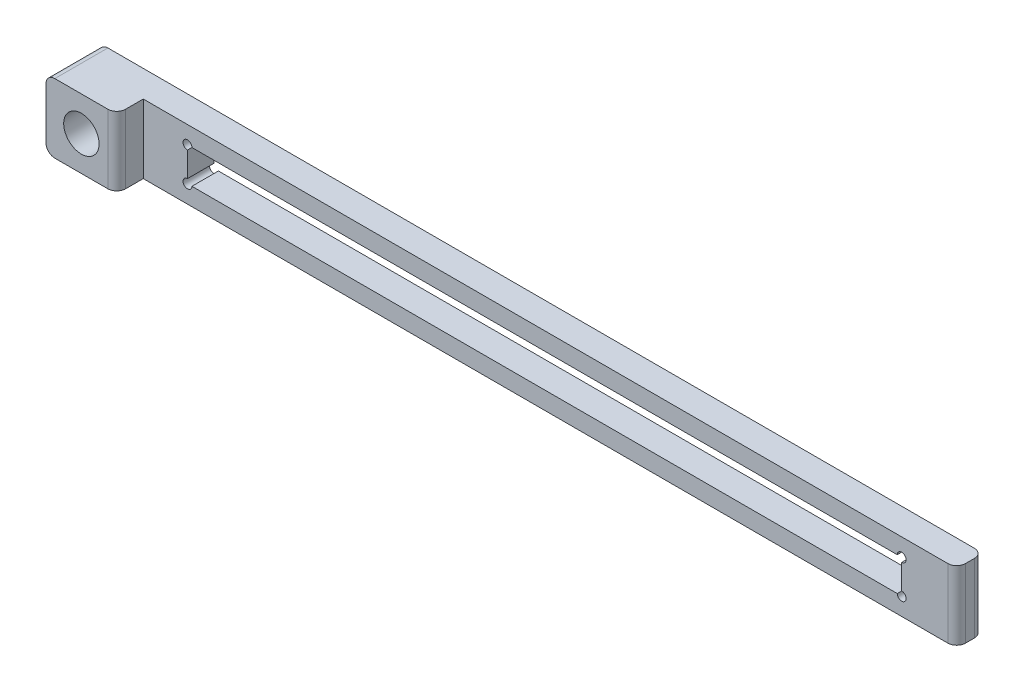
ISO-10303-21;
HEADER;
FILE_DESCRIPTION(('STEP AP214'),'2;1');
FILE_NAME('part.step','',(''),(''),'','','');
FILE_SCHEMA(('AUTOMOTIVE_DESIGN { 1 0 10303 214 1 1 1 1 }'));
ENDSEC;
DATA;
#1=APPLICATION_CONTEXT('core data for automotive mechanical design processes');
#2=APPLICATION_PROTOCOL_DEFINITION('international standard','automotive_design',2000,#1);
#3=PRODUCT_CONTEXT('',#1,'mechanical');
#4=PRODUCT('Part','Part','',(#3));
#5=PRODUCT_RELATED_PRODUCT_CATEGORY('part','',(#4));
#6=PRODUCT_DEFINITION_FORMATION('','',#4);
#7=PRODUCT_DEFINITION_CONTEXT('part definition',#1,'design');
#8=PRODUCT_DEFINITION('design','',#6,#7);
#9=PRODUCT_DEFINITION_SHAPE('','',#8);
#10=(LENGTH_UNIT() NAMED_UNIT(*) SI_UNIT(.MILLI.,.METRE.));
#11=(NAMED_UNIT(*) PLANE_ANGLE_UNIT() SI_UNIT($,.RADIAN.));
#12=(NAMED_UNIT(*) SI_UNIT($,.STERADIAN.) SOLID_ANGLE_UNIT());
#13=UNCERTAINTY_MEASURE_WITH_UNIT(LENGTH_MEASURE(1.E-05),#10,'distance_accuracy_value','');
#14=(GEOMETRIC_REPRESENTATION_CONTEXT(3) GLOBAL_UNCERTAINTY_ASSIGNED_CONTEXT((#13)) GLOBAL_UNIT_ASSIGNED_CONTEXT((#10,
#11,#12)) REPRESENTATION_CONTEXT('',''));
#15=CARTESIAN_POINT('',(0.,0.,0.));
#16=DIRECTION('',(0.,0.,1.));
#17=DIRECTION('',(1.,0.,0.));
#18=AXIS2_PLACEMENT_3D('',#15,#16,#17);
#19=CARTESIAN_POINT('',(0.,0.,1.5));
#20=DIRECTION('',(0.,0.,1.));
#21=DIRECTION('',(1.,0.,0.));
#22=AXIS2_PLACEMENT_3D('',#19,#20,#21);
#23=PLANE('',#22);
#24=CARTESIAN_POINT('',(-37.,-1.9,1.5));
#25=DIRECTION('',(0.,0.,1.));
#26=DIRECTION('',(1.,0.,0.));
#27=AXIS2_PLACEMENT_3D('',#24,#25,#26);
#28=CIRCLE('',#27,0.499999999999999);
#29=CARTESIAN_POINT('',(-37.,-1.4,1.5));
#30=VERTEX_POINT('',#29);
#31=CARTESIAN_POINT('',(-36.5,-1.9,1.5));
#32=VERTEX_POINT('',#31);
#33=EDGE_CURVE('E47',#30,#32,#28,.T.);
#34=ORIENTED_EDGE('',*,*,#33,.F.);
#35=DIRECTION('',(0.,-1.,0.));
#36=VECTOR('',#35,1.);
#37=CARTESIAN_POINT('',(-37.,1.9,1.5));
#38=LINE('',#37,#36);
#39=CARTESIAN_POINT('',(-37.,1.4,1.5));
#40=VERTEX_POINT('',#39);
#41=EDGE_CURVE('E190',#40,#30,#38,.T.);
#42=ORIENTED_EDGE('',*,*,#41,.F.);
#43=CARTESIAN_POINT('',(-37.,1.9,1.5));
#44=DIRECTION('',(0.,0.,1.));
#45=DIRECTION('',(1.,0.,0.));
#46=AXIS2_PLACEMENT_3D('',#43,#44,#45);
#47=CIRCLE('',#46,0.499999999999999);
#48=CARTESIAN_POINT('',(-36.5,1.9,1.5));
#49=VERTEX_POINT('',#48);
#50=EDGE_CURVE('E247',#49,#40,#47,.T.);
#51=ORIENTED_EDGE('',*,*,#50,.F.);
#52=DIRECTION('',(-1.,0.,0.));
#53=VECTOR('',#52,1.);
#54=CARTESIAN_POINT('',(-37.,1.9,1.5));
#55=LINE('',#54,#53);
#56=CARTESIAN_POINT('',(43.28,1.9,1.5));
#57=VERTEX_POINT('',#56);
#58=EDGE_CURVE('E182',#57,#49,#55,.T.);
#59=ORIENTED_EDGE('',*,*,#58,.F.);
#60=CARTESIAN_POINT('',(43.78,1.9,1.5));
#61=DIRECTION('',(0.,0.,1.));
#62=DIRECTION('',(1.,0.,0.));
#63=AXIS2_PLACEMENT_3D('',#60,#61,#62);
#64=CIRCLE('',#63,0.499999999999999);
#65=CARTESIAN_POINT('',(43.78,1.4,1.5));
#66=VERTEX_POINT('',#65);
#67=EDGE_CURVE('E165',#66,#57,#64,.T.);
#68=ORIENTED_EDGE('',*,*,#67,.F.);
#69=DIRECTION('',(0.,1.,0.));
#70=VECTOR('',#69,1.);
#71=CARTESIAN_POINT('',(43.78,1.9,1.5));
#72=LINE('',#71,#70);
#73=CARTESIAN_POINT('',(43.78,-1.4,1.5));
#74=VERTEX_POINT('',#73);
#75=EDGE_CURVE('E180',#74,#66,#72,.T.);
#76=ORIENTED_EDGE('',*,*,#75,.F.);
#77=CARTESIAN_POINT('',(43.78,-1.9,1.5));
#78=DIRECTION('',(0.,0.,1.));
#79=DIRECTION('',(1.,0.,0.));
#80=AXIS2_PLACEMENT_3D('',#77,#78,#79);
#81=CIRCLE('',#80,0.499999999999999);
#82=CARTESIAN_POINT('',(43.28,-1.9,1.5));
#83=VERTEX_POINT('',#82);
#84=EDGE_CURVE('E55',#83,#74,#81,.T.);
#85=ORIENTED_EDGE('',*,*,#84,.F.);
#86=DIRECTION('',(1.,0.,0.));
#87=VECTOR('',#86,1.);
#88=CARTESIAN_POINT('',(-37.,-1.9,1.5));
#89=LINE('',#88,#87);
#90=EDGE_CURVE('E185',#32,#83,#89,.T.);
#91=ORIENTED_EDGE('',*,*,#90,.F.);
#92=EDGE_LOOP('',(#34,#42,#51,#59,#68,#76,#85,#91));
#93=FACE_BOUND('',#92,.T.);
#94=DIRECTION('',(1.,0.,0.));
#95=VECTOR('',#94,1.);
#96=CARTESIAN_POINT('',(-50.,-3.9,1.5));
#97=LINE('',#96,#95);
#98=CARTESIAN_POINT('',(-42.,-3.9,1.5));
#99=VERTEX_POINT('',#98);
#100=CARTESIAN_POINT('',(49.,-3.9,1.5));
#101=VERTEX_POINT('',#100);
#102=EDGE_CURVE('E213',#99,#101,#97,.T.);
#103=ORIENTED_EDGE('',*,*,#102,.T.);
#104=DIRECTION('',(0.,1.,0.));
#105=VECTOR('',#104,1.);
#106=CARTESIAN_POINT('',(49.,3.9,1.5));
#107=LINE('',#106,#105);
#108=CARTESIAN_POINT('',(49.,3.9,1.5));
#109=VERTEX_POINT('',#108);
#110=EDGE_CURVE('E217',#101,#109,#107,.T.);
#111=ORIENTED_EDGE('',*,*,#110,.T.);
#112=DIRECTION('',(-1.,0.,0.));
#113=VECTOR('',#112,1.);
#114=CARTESIAN_POINT('',(-50.,3.9,1.5));
#115=LINE('',#114,#113);
#116=CARTESIAN_POINT('',(-42.,3.9,1.5));
#117=VERTEX_POINT('',#116);
#118=EDGE_CURVE('E210',#109,#117,#115,.T.);
#119=ORIENTED_EDGE('',*,*,#118,.T.);
#120=DIRECTION('',(0.,1.,0.));
#121=VECTOR('',#120,1.);
#122=CARTESIAN_POINT('',(-42.,3.9,1.5));
#123=LINE('',#122,#121);
#124=EDGE_CURVE('E262',#99,#117,#123,.T.);
#125=ORIENTED_EDGE('',*,*,#124,.F.);
#126=EDGE_LOOP('',(#103,#111,#119,#125));
#127=FACE_BOUND('',#126,.T.);
#128=ADVANCED_FACE('F33',(#93,#127),#23,.T.);
#129=CARTESIAN_POINT('',(0.,0.,-1.5));
#130=DIRECTION('',(0.,0.,1.));
#131=DIRECTION('',(1.,0.,0.));
#132=AXIS2_PLACEMENT_3D('',#129,#130,#131);
#133=PLANE('',#132);
#134=CARTESIAN_POINT('',(-46.,0.,-1.5));
#135=DIRECTION('',(0.,0.,1.));
#136=DIRECTION('',(1.,0.,0.));
#137=AXIS2_PLACEMENT_3D('',#134,#135,#136);
#138=CIRCLE('',#137,2.);
#139=CARTESIAN_POINT('',(-44.,0.,-1.5));
#140=VERTEX_POINT('',#139);
#141=EDGE_CURVE('E254',#140,#140,#138,.T.);
#142=ORIENTED_EDGE('',*,*,#141,.T.);
#143=EDGE_LOOP('',(#142));
#144=FACE_BOUND('',#143,.T.);
#145=DIRECTION('',(-1.,0.,0.));
#146=VECTOR('',#145,1.);
#147=CARTESIAN_POINT('',(-50.,3.9,-1.5));
#148=LINE('',#147,#146);
#149=CARTESIAN_POINT('',(49.,3.9,-1.5));
#150=VERTEX_POINT('',#149);
#151=CARTESIAN_POINT('',(-49.,3.9,-1.5));
#152=VERTEX_POINT('',#151);
#153=EDGE_CURVE('E187',#150,#152,#148,.T.);
#154=ORIENTED_EDGE('',*,*,#153,.F.);
#155=DIRECTION('',(0.,1.,0.));
#156=VECTOR('',#155,1.);
#157=CARTESIAN_POINT('',(49.,0.,-1.5));
#158=LINE('',#157,#156);
#159=CARTESIAN_POINT('',(49.,-3.9,-1.5));
#160=VERTEX_POINT('',#159);
#161=EDGE_CURVE('E295',#150,#160,#158,.F.);
#162=ORIENTED_EDGE('',*,*,#161,.T.);
#163=DIRECTION('',(1.,0.,0.));
#164=VECTOR('',#163,1.);
#165=CARTESIAN_POINT('',(-50.,-3.9,-1.5));
#166=LINE('',#165,#164);
#167=CARTESIAN_POINT('',(-49.,-3.9,-1.5));
#168=VERTEX_POINT('',#167);
#169=EDGE_CURVE('E214',#168,#160,#166,.T.);
#170=ORIENTED_EDGE('',*,*,#169,.F.);
#171=CARTESIAN_POINT('',(-49.,-2.9,-1.5));
#172=DIRECTION('',(0.,0.,1.));
#173=DIRECTION('',(1.,0.,0.));
#174=AXIS2_PLACEMENT_3D('',#171,#172,#173);
#175=CIRCLE('',#174,1.);
#176=CARTESIAN_POINT('',(-50.,-2.89999999999999,-1.5));
#177=VERTEX_POINT('',#176);
#178=EDGE_CURVE('E348',#168,#177,#175,.F.);
#179=ORIENTED_EDGE('',*,*,#178,.T.);
#180=DIRECTION('',(0.,-1.,0.));
#181=VECTOR('',#180,1.);
#182=CARTESIAN_POINT('',(-50.,3.9,-1.5));
#183=LINE('',#182,#181);
#184=CARTESIAN_POINT('',(-50.,2.9,-1.5));
#185=VERTEX_POINT('',#184);
#186=EDGE_CURVE('E323',#185,#177,#183,.T.);
#187=ORIENTED_EDGE('',*,*,#186,.F.);
#188=CARTESIAN_POINT('',(-49.,2.9,-1.5));
#189=DIRECTION('',(0.,0.,1.));
#190=DIRECTION('',(1.,0.,0.));
#191=AXIS2_PLACEMENT_3D('',#188,#189,#190);
#192=CIRCLE('',#191,1.);
#193=EDGE_CURVE('E335',#185,#152,#192,.F.);
#194=ORIENTED_EDGE('',*,*,#193,.T.);
#195=EDGE_LOOP('',(#154,#162,#170,#179,#187,#194));
#196=FACE_BOUND('',#195,.T.);
#197=DIRECTION('',(0.,-1.,0.));
#198=VECTOR('',#197,1.);
#199=CARTESIAN_POINT('',(-37.,1.9,-1.5));
#200=LINE('',#199,#198);
#201=CARTESIAN_POINT('',(-37.,1.4,-1.5));
#202=VERTEX_POINT('',#201);
#203=CARTESIAN_POINT('',(-37.,-1.4,-1.5));
#204=VERTEX_POINT('',#203);
#205=EDGE_CURVE('E194',#202,#204,#200,.T.);
#206=ORIENTED_EDGE('',*,*,#205,.T.);
#207=CARTESIAN_POINT('',(-37.,-1.9,-1.5));
#208=DIRECTION('',(0.,0.,1.));
#209=DIRECTION('',(1.,0.,0.));
#210=AXIS2_PLACEMENT_3D('',#207,#208,#209);
#211=CIRCLE('',#210,0.499999999999999);
#212=CARTESIAN_POINT('',(-36.5,-1.9,-1.5));
#213=VERTEX_POINT('',#212);
#214=EDGE_CURVE('E174',#204,#213,#211,.T.);
#215=ORIENTED_EDGE('',*,*,#214,.T.);
#216=DIRECTION('',(1.,0.,0.));
#217=VECTOR('',#216,1.);
#218=CARTESIAN_POINT('',(-37.,-1.9,-1.5));
#219=LINE('',#218,#217);
#220=CARTESIAN_POINT('',(43.28,-1.9,-1.5));
#221=VERTEX_POINT('',#220);
#222=EDGE_CURVE('E197',#213,#221,#219,.T.);
#223=ORIENTED_EDGE('',*,*,#222,.T.);
#224=CARTESIAN_POINT('',(43.78,-1.9,-1.5));
#225=DIRECTION('',(0.,0.,1.));
#226=DIRECTION('',(1.,0.,0.));
#227=AXIS2_PLACEMENT_3D('',#224,#225,#226);
#228=CIRCLE('',#227,0.499999999999999);
#229=CARTESIAN_POINT('',(43.78,-1.4,-1.5));
#230=VERTEX_POINT('',#229);
#231=EDGE_CURVE('E232',#221,#230,#228,.T.);
#232=ORIENTED_EDGE('',*,*,#231,.T.);
#233=DIRECTION('',(0.,1.,0.));
#234=VECTOR('',#233,1.);
#235=CARTESIAN_POINT('',(43.78,1.9,-1.5));
#236=LINE('',#235,#234);
#237=CARTESIAN_POINT('',(43.78,1.4,-1.5));
#238=VERTEX_POINT('',#237);
#239=EDGE_CURVE('E201',#230,#238,#236,.T.);
#240=ORIENTED_EDGE('',*,*,#239,.T.);
#241=CARTESIAN_POINT('',(43.78,1.9,-1.5));
#242=DIRECTION('',(0.,0.,1.));
#243=DIRECTION('',(1.,0.,0.));
#244=AXIS2_PLACEMENT_3D('',#241,#242,#243);
#245=CIRCLE('',#244,0.499999999999999);
#246=CARTESIAN_POINT('',(43.28,1.9,-1.5));
#247=VERTEX_POINT('',#246);
#248=EDGE_CURVE('E168',#238,#247,#245,.T.);
#249=ORIENTED_EDGE('',*,*,#248,.T.);
#250=DIRECTION('',(-1.,0.,0.));
#251=VECTOR('',#250,1.);
#252=CARTESIAN_POINT('',(-37.,1.9,-1.5));
#253=LINE('',#252,#251);
#254=CARTESIAN_POINT('',(-36.5,1.9,-1.5));
#255=VERTEX_POINT('',#254);
#256=EDGE_CURVE('E203',#247,#255,#253,.T.);
#257=ORIENTED_EDGE('',*,*,#256,.T.);
#258=CARTESIAN_POINT('',(-37.,1.9,-1.5));
#259=DIRECTION('',(0.,0.,1.));
#260=DIRECTION('',(1.,0.,0.));
#261=AXIS2_PLACEMENT_3D('',#258,#259,#260);
#262=CIRCLE('',#261,0.499999999999999);
#263=EDGE_CURVE('E248',#255,#202,#262,.T.);
#264=ORIENTED_EDGE('',*,*,#263,.T.);
#265=EDGE_LOOP('',(#206,#215,#223,#232,#240,#249,#257,#264));
#266=FACE_BOUND('',#265,.T.);
#267=ADVANCED_FACE('F235',(#144,#196,#266),#133,.F.);
#268=CARTESIAN_POINT('',(50.,3.9,1.5));
#269=DIRECTION('',(-1.,0.,0.));
#270=DIRECTION('',(0.,0.,1.));
#271=AXIS2_PLACEMENT_3D('',#268,#269,#270);
#272=PLANE('',#271);
#273=DIRECTION('',(0.,0.,-1.));
#274=VECTOR('',#273,1.);
#275=CARTESIAN_POINT('',(50.,3.9,1.5));
#276=LINE('',#275,#274);
#277=CARTESIAN_POINT('',(50.,3.9,0.5));
#278=VERTEX_POINT('',#277);
#279=CARTESIAN_POINT('',(50.,3.9,-0.5));
#280=VERTEX_POINT('',#279);
#281=EDGE_CURVE('E316',#278,#280,#276,.T.);
#282=ORIENTED_EDGE('',*,*,#281,.F.);
#283=DIRECTION('',(0.,1.,0.));
#284=VECTOR('',#283,1.);
#285=CARTESIAN_POINT('',(50.,-3.9,0.5));
#286=LINE('',#285,#284);
#287=CARTESIAN_POINT('',(50.,-3.9,0.5));
#288=VERTEX_POINT('',#287);
#289=EDGE_CURVE('E222',#278,#288,#286,.F.);
#290=ORIENTED_EDGE('',*,*,#289,.T.);
#291=DIRECTION('',(0.,0.,-1.));
#292=VECTOR('',#291,1.);
#293=CARTESIAN_POINT('',(50.,-3.9,1.5));
#294=LINE('',#293,#292);
#295=CARTESIAN_POINT('',(50.,-3.9,-0.5));
#296=VERTEX_POINT('',#295);
#297=EDGE_CURVE('E307',#288,#296,#294,.T.);
#298=ORIENTED_EDGE('',*,*,#297,.T.);
#299=DIRECTION('',(0.,1.,0.));
#300=VECTOR('',#299,1.);
#301=CARTESIAN_POINT('',(50.,3.9,-0.5));
#302=LINE('',#301,#300);
#303=EDGE_CURVE('E291',#296,#280,#302,.T.);
#304=ORIENTED_EDGE('',*,*,#303,.T.);
#305=EDGE_LOOP('',(#282,#290,#298,#304));
#306=FACE_BOUND('',#305,.T.);
#307=ADVANCED_FACE('F315',(#306),#272,.F.);
#308=CARTESIAN_POINT('',(-50.,3.9,1.5));
#309=DIRECTION('',(0.,-1.,0.));
#310=DIRECTION('',(1.,0.,0.));
#311=AXIS2_PLACEMENT_3D('',#308,#309,#310);
#312=PLANE('',#311);
#313=ORIENTED_EDGE('',*,*,#118,.F.);
#314=CARTESIAN_POINT('',(49.,3.9,0.5));
#315=DIRECTION('',(0.,-1.,0.));
#316=DIRECTION('',(1.,0.,0.));
#317=AXIS2_PLACEMENT_3D('',#314,#315,#316);
#318=CIRCLE('',#317,1.);
#319=EDGE_CURVE('E220',#109,#278,#318,.F.);
#320=ORIENTED_EDGE('',*,*,#319,.T.);
#321=ORIENTED_EDGE('',*,*,#281,.T.);
#322=CARTESIAN_POINT('',(49.,3.9,-0.5));
#323=DIRECTION('',(0.,-1.,0.));
#324=DIRECTION('',(1.,0.,0.));
#325=AXIS2_PLACEMENT_3D('',#322,#323,#324);
#326=CIRCLE('',#325,1.);
#327=EDGE_CURVE('E294',#280,#150,#326,.F.);
#328=ORIENTED_EDGE('',*,*,#327,.T.);
#329=ORIENTED_EDGE('',*,*,#153,.T.);
#330=DIRECTION('',(0.,0.,-1.));
#331=VECTOR('',#330,1.);
#332=CARTESIAN_POINT('',(-49.,3.9,1.5));
#333=LINE('',#332,#331);
#334=CARTESIAN_POINT('',(-49.,3.9,4.5));
#335=VERTEX_POINT('',#334);
#336=EDGE_CURVE('E332',#152,#335,#333,.F.);
#337=ORIENTED_EDGE('',*,*,#336,.T.);
#338=DIRECTION('',(-1.,0.,0.));
#339=VECTOR('',#338,1.);
#340=CARTESIAN_POINT('',(-50.,3.9,4.5));
#341=LINE('',#340,#339);
#342=CARTESIAN_POINT('',(-43.,3.9,4.5));
#343=VERTEX_POINT('',#342);
#344=EDGE_CURVE('E265',#343,#335,#341,.T.);
#345=ORIENTED_EDGE('',*,*,#344,.F.);
#346=CARTESIAN_POINT('',(-43.,3.9,3.5));
#347=DIRECTION('',(0.,-1.,0.));
#348=DIRECTION('',(1.,0.,0.));
#349=AXIS2_PLACEMENT_3D('',#346,#347,#348);
#350=CIRCLE('',#349,1.);
#351=CARTESIAN_POINT('',(-42.,3.9,3.5));
#352=VERTEX_POINT('',#351);
#353=EDGE_CURVE('E284',#343,#352,#350,.F.);
#354=ORIENTED_EDGE('',*,*,#353,.T.);
#355=DIRECTION('',(0.,0.,-1.));
#356=VECTOR('',#355,1.);
#357=CARTESIAN_POINT('',(-42.,3.9,4.5));
#358=LINE('',#357,#356);
#359=EDGE_CURVE('E267',#352,#117,#358,.T.);
#360=ORIENTED_EDGE('',*,*,#359,.T.);
#361=EDGE_LOOP('',(#313,#320,#321,#328,#329,#337,#345,#354,#360));
#362=FACE_BOUND('',#361,.T.);
#363=ADVANCED_FACE('F329',(#362),#312,.F.);
#364=CARTESIAN_POINT('',(-50.,3.9,1.5));
#365=DIRECTION('',(1.,0.,0.));
#366=DIRECTION('',(0.,0.,-1.));
#367=AXIS2_PLACEMENT_3D('',#364,#365,#366);
#368=PLANE('',#367);
#369=ORIENTED_EDGE('',*,*,#186,.T.);
#370=DIRECTION('',(0.,0.,-1.));
#371=VECTOR('',#370,1.);
#372=CARTESIAN_POINT('',(-50.,-2.89999999999999,1.5));
#373=LINE('',#372,#371);
#374=CARTESIAN_POINT('',(-50.,-2.89999999999999,4.5));
#375=VERTEX_POINT('',#374);
#376=EDGE_CURVE('E350',#177,#375,#373,.F.);
#377=ORIENTED_EDGE('',*,*,#376,.T.);
#378=DIRECTION('',(0.,-1.,0.));
#379=VECTOR('',#378,1.);
#380=CARTESIAN_POINT('',(-50.,3.9,4.5));
#381=LINE('',#380,#379);
#382=CARTESIAN_POINT('',(-50.,2.9,4.5));
#383=VERTEX_POINT('',#382);
#384=EDGE_CURVE('E258',#383,#375,#381,.T.);
#385=ORIENTED_EDGE('',*,*,#384,.F.);
#386=DIRECTION('',(0.,0.,-1.));
#387=VECTOR('',#386,1.);
#388=CARTESIAN_POINT('',(-50.,2.9,1.5));
#389=LINE('',#388,#387);
#390=EDGE_CURVE('E319',#383,#185,#389,.T.);
#391=ORIENTED_EDGE('',*,*,#390,.T.);
#392=EDGE_LOOP('',(#369,#377,#385,#391));
#393=FACE_BOUND('',#392,.T.);
#394=ADVANCED_FACE('F392',(#393),#368,.F.);
#395=CARTESIAN_POINT('',(-50.,-3.9,1.5));
#396=DIRECTION('',(0.,1.,0.));
#397=DIRECTION('',(-1.,0.,0.));
#398=AXIS2_PLACEMENT_3D('',#395,#396,#397);
#399=PLANE('',#398);
#400=ORIENTED_EDGE('',*,*,#297,.F.);
#401=CARTESIAN_POINT('',(49.,-3.9,0.5));
#402=DIRECTION('',(0.,1.,0.));
#403=DIRECTION('',(-1.,0.,0.));
#404=AXIS2_PLACEMENT_3D('',#401,#402,#403);
#405=CIRCLE('',#404,1.);
#406=EDGE_CURVE('E224',#288,#101,#405,.F.);
#407=ORIENTED_EDGE('',*,*,#406,.T.);
#408=ORIENTED_EDGE('',*,*,#102,.F.);
#409=DIRECTION('',(0.,0.,-1.));
#410=VECTOR('',#409,1.);
#411=CARTESIAN_POINT('',(-42.,-3.9,4.5));
#412=LINE('',#411,#410);
#413=CARTESIAN_POINT('',(-42.,-3.9,3.5));
#414=VERTEX_POINT('',#413);
#415=EDGE_CURVE('E198',#414,#99,#412,.T.);
#416=ORIENTED_EDGE('',*,*,#415,.F.);
#417=CARTESIAN_POINT('',(-43.,-3.9,3.5));
#418=DIRECTION('',(0.,1.,0.));
#419=DIRECTION('',(-1.,0.,0.));
#420=AXIS2_PLACEMENT_3D('',#417,#418,#419);
#421=CIRCLE('',#420,1.);
#422=CARTESIAN_POINT('',(-43.,-3.9,4.5));
#423=VERTEX_POINT('',#422);
#424=EDGE_CURVE('E289',#414,#423,#421,.F.);
#425=ORIENTED_EDGE('',*,*,#424,.T.);
#426=DIRECTION('',(1.,0.,0.));
#427=VECTOR('',#426,1.);
#428=CARTESIAN_POINT('',(-50.,-3.9,4.5));
#429=LINE('',#428,#427);
#430=CARTESIAN_POINT('',(-49.,-3.9,4.5));
#431=VERTEX_POINT('',#430);
#432=EDGE_CURVE('E261',#431,#423,#429,.T.);
#433=ORIENTED_EDGE('',*,*,#432,.F.);
#434=DIRECTION('',(0.,0.,-1.));
#435=VECTOR('',#434,1.);
#436=CARTESIAN_POINT('',(-49.,-3.9,1.5));
#437=LINE('',#436,#435);
#438=EDGE_CURVE('E343',#431,#168,#437,.T.);
#439=ORIENTED_EDGE('',*,*,#438,.T.);
#440=ORIENTED_EDGE('',*,*,#169,.T.);
#441=CARTESIAN_POINT('',(49.,-3.9,-0.5));
#442=DIRECTION('',(0.,1.,0.));
#443=DIRECTION('',(-1.,0.,0.));
#444=AXIS2_PLACEMENT_3D('',#441,#442,#443);
#445=CIRCLE('',#444,1.);
#446=EDGE_CURVE('E215',#160,#296,#445,.F.);
#447=ORIENTED_EDGE('',*,*,#446,.T.);
#448=EDGE_LOOP('',(#400,#407,#408,#416,#425,#433,#439,#440,#447));
#449=FACE_BOUND('',#448,.T.);
#450=ADVANCED_FACE('F306',(#449),#399,.F.);
#451=CARTESIAN_POINT('',(-37.,1.9,1.5));
#452=DIRECTION('',(1.,0.,0.));
#453=DIRECTION('',(0.,1.,0.));
#454=AXIS2_PLACEMENT_3D('',#451,#452,#453);
#455=PLANE('',#454);
#456=DIRECTION('',(0.,0.,1.));
#457=VECTOR('',#456,1.);
#458=CARTESIAN_POINT('',(-37.,-1.4,-1.5));
#459=LINE('',#458,#457);
#460=EDGE_CURVE('E245',#204,#30,#459,.T.);
#461=ORIENTED_EDGE('',*,*,#460,.F.);
#462=ORIENTED_EDGE('',*,*,#205,.F.);
#463=DIRECTION('',(0.,0.,1.));
#464=VECTOR('',#463,1.);
#465=CARTESIAN_POINT('',(-37.,1.4,-1.5));
#466=LINE('',#465,#464);
#467=EDGE_CURVE('E251',#40,#202,#466,.F.);
#468=ORIENTED_EDGE('',*,*,#467,.F.);
#469=ORIENTED_EDGE('',*,*,#41,.T.);
#470=EDGE_LOOP('',(#461,#462,#468,#469));
#471=FACE_BOUND('',#470,.T.);
#472=ADVANCED_FACE('F387',(#471),#455,.T.);
#473=CARTESIAN_POINT('',(-37.,-1.9,1.5));
#474=DIRECTION('',(0.,1.,0.));
#475=DIRECTION('',(0.,0.,1.));
#476=AXIS2_PLACEMENT_3D('',#473,#474,#475);
#477=PLANE('',#476);
#478=DIRECTION('',(0.,0.,1.));
#479=VECTOR('',#478,1.);
#480=CARTESIAN_POINT('',(-36.5,-1.9,-1.5));
#481=LINE('',#480,#479);
#482=EDGE_CURVE('E11',#32,#213,#481,.F.);
#483=ORIENTED_EDGE('',*,*,#482,.F.);
#484=ORIENTED_EDGE('',*,*,#90,.T.);
#485=DIRECTION('',(0.,0.,1.));
#486=VECTOR('',#485,1.);
#487=CARTESIAN_POINT('',(43.28,-1.9,-1.5));
#488=LINE('',#487,#486);
#489=EDGE_CURVE('E173',#221,#83,#488,.T.);
#490=ORIENTED_EDGE('',*,*,#489,.F.);
#491=ORIENTED_EDGE('',*,*,#222,.F.);
#492=EDGE_LOOP('',(#483,#484,#490,#491));
#493=FACE_BOUND('',#492,.T.);
#494=ADVANCED_FACE('F464',(#493),#477,.T.);
#495=CARTESIAN_POINT('',(43.78,1.9,1.5));
#496=DIRECTION('',(-1.,0.,0.));
#497=DIRECTION('',(0.,-1.,0.));
#498=AXIS2_PLACEMENT_3D('',#495,#496,#497);
#499=PLANE('',#498);
#500=DIRECTION('',(0.,0.,1.));
#501=VECTOR('',#500,1.);
#502=CARTESIAN_POINT('',(43.78,-1.4,-1.5));
#503=LINE('',#502,#501);
#504=EDGE_CURVE('E41',#74,#230,#503,.F.);
#505=ORIENTED_EDGE('',*,*,#504,.F.);
#506=ORIENTED_EDGE('',*,*,#75,.T.);
#507=DIRECTION('',(0.,0.,1.));
#508=VECTOR('',#507,1.);
#509=CARTESIAN_POINT('',(43.78,1.4,-1.5));
#510=LINE('',#509,#508);
#511=EDGE_CURVE('E162',#238,#66,#510,.T.);
#512=ORIENTED_EDGE('',*,*,#511,.F.);
#513=ORIENTED_EDGE('',*,*,#239,.F.);
#514=EDGE_LOOP('',(#505,#506,#512,#513));
#515=FACE_BOUND('',#514,.T.);
#516=ADVANCED_FACE('F184',(#515),#499,.T.);
#517=CARTESIAN_POINT('',(-37.,1.9,1.5));
#518=DIRECTION('',(0.,-1.,0.));
#519=DIRECTION('',(1.,0.,0.));
#520=AXIS2_PLACEMENT_3D('',#517,#518,#519);
#521=PLANE('',#520);
#522=DIRECTION('',(0.,0.,1.));
#523=VECTOR('',#522,1.);
#524=CARTESIAN_POINT('',(43.28,1.9,-1.5));
#525=LINE('',#524,#523);
#526=EDGE_CURVE('E229',#57,#247,#525,.F.);
#527=ORIENTED_EDGE('',*,*,#526,.F.);
#528=ORIENTED_EDGE('',*,*,#58,.T.);
#529=DIRECTION('',(0.,0.,1.));
#530=VECTOR('',#529,1.);
#531=CARTESIAN_POINT('',(-36.5,1.9,-1.5));
#532=LINE('',#531,#530);
#533=EDGE_CURVE('E226',#255,#49,#532,.T.);
#534=ORIENTED_EDGE('',*,*,#533,.F.);
#535=ORIENTED_EDGE('',*,*,#256,.F.);
#536=EDGE_LOOP('',(#527,#528,#534,#535));
#537=FACE_BOUND('',#536,.T.);
#538=ADVANCED_FACE('F481',(#537),#521,.T.);
#539=CARTESIAN_POINT('',(-42.,3.9,4.5));
#540=DIRECTION('',(-1.,0.,0.));
#541=DIRECTION('',(0.,0.,1.));
#542=AXIS2_PLACEMENT_3D('',#539,#540,#541);
#543=PLANE('',#542);
#544=ORIENTED_EDGE('',*,*,#359,.F.);
#545=DIRECTION('',(0.,1.,0.));
#546=VECTOR('',#545,1.);
#547=CARTESIAN_POINT('',(-42.,-3.9,3.5));
#548=LINE('',#547,#546);
#549=EDGE_CURVE('E286',#352,#414,#548,.F.);
#550=ORIENTED_EDGE('',*,*,#549,.T.);
#551=ORIENTED_EDGE('',*,*,#415,.T.);
#552=ORIENTED_EDGE('',*,*,#124,.T.);
#553=EDGE_LOOP('',(#544,#550,#551,#552));
#554=FACE_BOUND('',#553,.T.);
#555=ADVANCED_FACE('F363',(#554),#543,.F.);
#556=CARTESIAN_POINT('',(0.,0.,4.5));
#557=DIRECTION('',(0.,0.,1.));
#558=DIRECTION('',(1.,0.,0.));
#559=AXIS2_PLACEMENT_3D('',#556,#557,#558);
#560=PLANE('',#559);
#561=CARTESIAN_POINT('',(-46.,0.,4.5));
#562=DIRECTION('',(0.,0.,1.));
#563=DIRECTION('',(1.,0.,0.));
#564=AXIS2_PLACEMENT_3D('',#561,#562,#563);
#565=CIRCLE('',#564,2.);
#566=CARTESIAN_POINT('',(-44.,0.,4.5));
#567=VERTEX_POINT('',#566);
#568=EDGE_CURVE('E257',#567,#567,#565,.T.);
#569=ORIENTED_EDGE('',*,*,#568,.F.);
#570=EDGE_LOOP('',(#569));
#571=FACE_BOUND('',#570,.T.);
#572=ORIENTED_EDGE('',*,*,#432,.T.);
#573=DIRECTION('',(0.,1.,0.));
#574=VECTOR('',#573,1.);
#575=CARTESIAN_POINT('',(-43.,3.9,4.5));
#576=LINE('',#575,#574);
#577=EDGE_CURVE('E282',#423,#343,#576,.T.);
#578=ORIENTED_EDGE('',*,*,#577,.T.);
#579=ORIENTED_EDGE('',*,*,#344,.T.);
#580=CARTESIAN_POINT('',(-49.,2.9,4.5));
#581=DIRECTION('',(0.,0.,1.));
#582=DIRECTION('',(1.,0.,0.));
#583=AXIS2_PLACEMENT_3D('',#580,#581,#582);
#584=CIRCLE('',#583,1.);
#585=EDGE_CURVE('E341',#335,#383,#584,.T.);
#586=ORIENTED_EDGE('',*,*,#585,.T.);
#587=ORIENTED_EDGE('',*,*,#384,.T.);
#588=CARTESIAN_POINT('',(-49.,-2.9,4.5));
#589=DIRECTION('',(0.,0.,1.));
#590=DIRECTION('',(1.,0.,0.));
#591=AXIS2_PLACEMENT_3D('',#588,#589,#590);
#592=CIRCLE('',#591,1.);
#593=EDGE_CURVE('E351',#375,#431,#592,.T.);
#594=ORIENTED_EDGE('',*,*,#593,.T.);
#595=EDGE_LOOP('',(#572,#578,#579,#586,#587,#594));
#596=FACE_BOUND('',#595,.T.);
#597=ADVANCED_FACE('F357',(#571,#596),#560,.T.);
#598=CARTESIAN_POINT('',(-46.,0.,-1.5));
#599=DIRECTION('',(0.,0.,1.));
#600=DIRECTION('',(1.,0.,0.));
#601=AXIS2_PLACEMENT_3D('',#598,#599,#600);
#602=CYLINDRICAL_SURFACE('',#601,2.);
#603=ORIENTED_EDGE('',*,*,#568,.T.);
#604=EDGE_LOOP('',(#603));
#605=FACE_BOUND('',#604,.T.);
#606=ORIENTED_EDGE('',*,*,#141,.F.);
#607=EDGE_LOOP('',(#606));
#608=FACE_BOUND('',#607,.T.);
#609=ADVANCED_FACE('F403',(#605,#608),#602,.F.);
#610=CARTESIAN_POINT('',(-49.,2.9,1.5));
#611=DIRECTION('',(0.,0.,-1.));
#612=DIRECTION('',(-1.,0.,0.));
#613=AXIS2_PLACEMENT_3D('',#610,#611,#612);
#614=CYLINDRICAL_SURFACE('',#613,1.);
#615=ORIENTED_EDGE('',*,*,#585,.F.);
#616=ORIENTED_EDGE('',*,*,#336,.F.);
#617=ORIENTED_EDGE('',*,*,#193,.F.);
#618=ORIENTED_EDGE('',*,*,#390,.F.);
#619=EDGE_LOOP('',(#615,#616,#617,#618));
#620=FACE_BOUND('',#619,.T.);
#621=ADVANCED_FACE('F340',(#620),#614,.T.);
#622=CARTESIAN_POINT('',(-49.,-2.9,1.5));
#623=DIRECTION('',(0.,0.,-1.));
#624=DIRECTION('',(-1.,0.,0.));
#625=AXIS2_PLACEMENT_3D('',#622,#623,#624);
#626=CYLINDRICAL_SURFACE('',#625,1.);
#627=ORIENTED_EDGE('',*,*,#593,.F.);
#628=ORIENTED_EDGE('',*,*,#376,.F.);
#629=ORIENTED_EDGE('',*,*,#178,.F.);
#630=ORIENTED_EDGE('',*,*,#438,.F.);
#631=EDGE_LOOP('',(#627,#628,#629,#630));
#632=FACE_BOUND('',#631,.T.);
#633=ADVANCED_FACE('F402',(#632),#626,.T.);
#634=CARTESIAN_POINT('',(-43.,0.,3.5));
#635=DIRECTION('',(0.,-1.,0.));
#636=DIRECTION('',(0.,0.,-1.));
#637=AXIS2_PLACEMENT_3D('',#634,#635,#636);
#638=CYLINDRICAL_SURFACE('',#637,1.);
#639=ORIENTED_EDGE('',*,*,#424,.F.);
#640=ORIENTED_EDGE('',*,*,#549,.F.);
#641=ORIENTED_EDGE('',*,*,#353,.F.);
#642=ORIENTED_EDGE('',*,*,#577,.F.);
#643=EDGE_LOOP('',(#639,#640,#641,#642));
#644=FACE_BOUND('',#643,.T.);
#645=ADVANCED_FACE('F366',(#644),#638,.T.);
#646=CARTESIAN_POINT('',(49.,3.9,-0.5));
#647=DIRECTION('',(0.,1.,0.));
#648=DIRECTION('',(0.,0.,1.));
#649=AXIS2_PLACEMENT_3D('',#646,#647,#648);
#650=CYLINDRICAL_SURFACE('',#649,1.);
#651=ORIENTED_EDGE('',*,*,#446,.F.);
#652=ORIENTED_EDGE('',*,*,#161,.F.);
#653=ORIENTED_EDGE('',*,*,#327,.F.);
#654=ORIENTED_EDGE('',*,*,#303,.F.);
#655=EDGE_LOOP('',(#651,#652,#653,#654));
#656=FACE_BOUND('',#655,.T.);
#657=ADVANCED_FACE('F312',(#656),#650,.T.);
#658=CARTESIAN_POINT('',(49.,0.,0.5));
#659=DIRECTION('',(0.,-1.,0.));
#660=DIRECTION('',(0.,0.,-1.));
#661=AXIS2_PLACEMENT_3D('',#658,#659,#660);
#662=CYLINDRICAL_SURFACE('',#661,1.);
#663=ORIENTED_EDGE('',*,*,#406,.F.);
#664=ORIENTED_EDGE('',*,*,#289,.F.);
#665=ORIENTED_EDGE('',*,*,#319,.F.);
#666=ORIENTED_EDGE('',*,*,#110,.F.);
#667=EDGE_LOOP('',(#663,#664,#665,#666));
#668=FACE_BOUND('',#667,.T.);
#669=ADVANCED_FACE('F35',(#668),#662,.T.);
#670=CARTESIAN_POINT('',(-37.,1.9,-1.5));
#671=DIRECTION('',(0.,0.,1.));
#672=DIRECTION('',(1.,0.,0.));
#673=AXIS2_PLACEMENT_3D('',#670,#671,#672);
#674=CYLINDRICAL_SURFACE('',#673,0.499999999999999);
#675=ORIENTED_EDGE('',*,*,#467,.T.);
#676=ORIENTED_EDGE('',*,*,#263,.F.);
#677=ORIENTED_EDGE('',*,*,#533,.T.);
#678=ORIENTED_EDGE('',*,*,#50,.T.);
#679=EDGE_LOOP('',(#675,#676,#677,#678));
#680=FACE_BOUND('',#679,.T.);
#681=ADVANCED_FACE('F372',(#680),#674,.F.);
#682=CARTESIAN_POINT('',(43.78,1.9,-1.5));
#683=DIRECTION('',(0.,0.,1.));
#684=DIRECTION('',(1.,0.,0.));
#685=AXIS2_PLACEMENT_3D('',#682,#683,#684);
#686=CYLINDRICAL_SURFACE('',#685,0.499999999999999);
#687=ORIENTED_EDGE('',*,*,#511,.T.);
#688=ORIENTED_EDGE('',*,*,#67,.T.);
#689=ORIENTED_EDGE('',*,*,#526,.T.);
#690=ORIENTED_EDGE('',*,*,#248,.F.);
#691=EDGE_LOOP('',(#687,#688,#689,#690));
#692=FACE_BOUND('',#691,.T.);
#693=ADVANCED_FACE('F164',(#692),#686,.F.);
#694=CARTESIAN_POINT('',(43.78,-1.9,-1.5));
#695=DIRECTION('',(0.,0.,1.));
#696=DIRECTION('',(1.,0.,0.));
#697=AXIS2_PLACEMENT_3D('',#694,#695,#696);
#698=CYLINDRICAL_SURFACE('',#697,0.499999999999999);
#699=ORIENTED_EDGE('',*,*,#489,.T.);
#700=ORIENTED_EDGE('',*,*,#84,.T.);
#701=ORIENTED_EDGE('',*,*,#504,.T.);
#702=ORIENTED_EDGE('',*,*,#231,.F.);
#703=EDGE_LOOP('',(#699,#700,#701,#702));
#704=FACE_BOUND('',#703,.T.);
#705=ADVANCED_FACE('F231',(#704),#698,.F.);
#706=CARTESIAN_POINT('',(-37.,-1.9,-1.5));
#707=DIRECTION('',(0.,0.,1.));
#708=DIRECTION('',(1.,0.,0.));
#709=AXIS2_PLACEMENT_3D('',#706,#707,#708);
#710=CYLINDRICAL_SURFACE('',#709,0.499999999999999);
#711=ORIENTED_EDGE('',*,*,#460,.T.);
#712=ORIENTED_EDGE('',*,*,#33,.T.);
#713=ORIENTED_EDGE('',*,*,#482,.T.);
#714=ORIENTED_EDGE('',*,*,#214,.F.);
#715=EDGE_LOOP('',(#711,#712,#713,#714));
#716=FACE_BOUND('',#715,.T.);
#717=ADVANCED_FACE('F512',(#716),#710,.F.);
#718=CLOSED_SHELL('',(#128,#267,#307,#363,#394,#450,#472,#494,#516,#538,#555,#597,#609,#621,
#633,#645,#657,#669,#681,#693,#705,#717));
#719=MANIFOLD_SOLID_BREP('B2',#718);
#720=ADVANCED_BREP_SHAPE_REPRESENTATION('',(#18,#719),#14);
#721=SHAPE_DEFINITION_REPRESENTATION(#9,#720);
ENDSEC;
END-ISO-10303-21;
